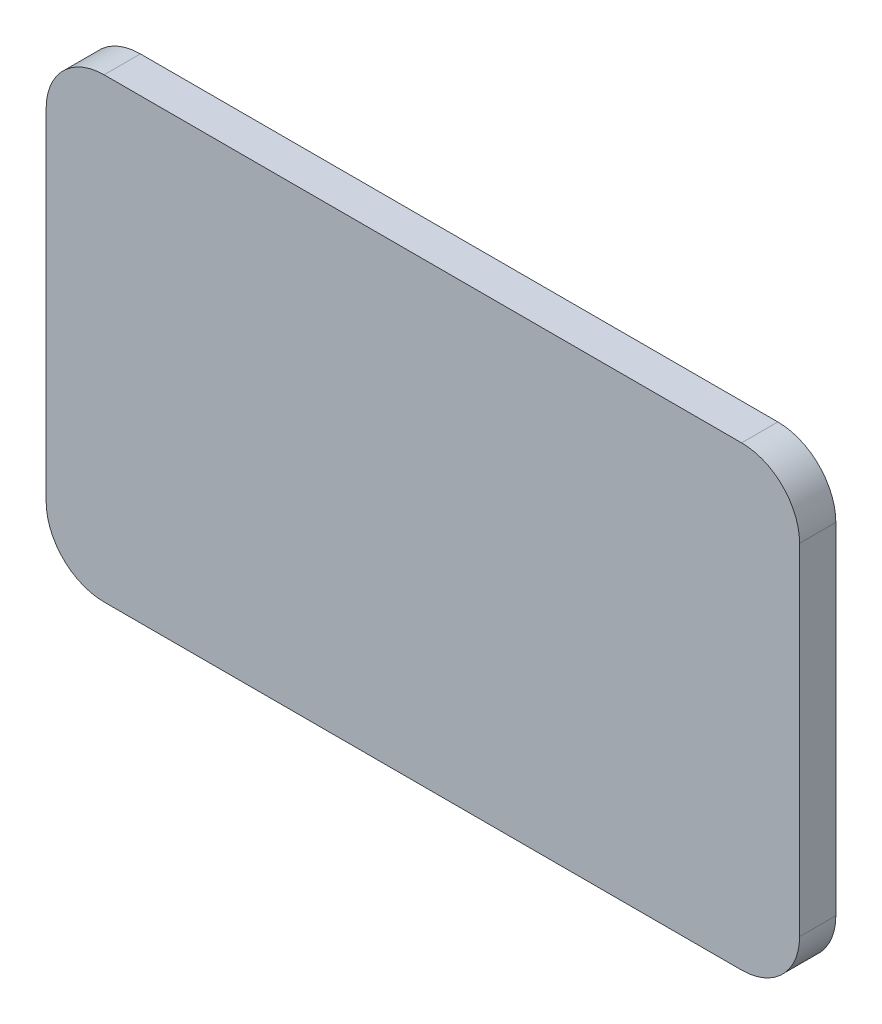
ISO-10303-21;
HEADER;
FILE_DESCRIPTION(('STEP AP214'),'2;1');
FILE_NAME('part.step','',(''),(''),'','','');
FILE_SCHEMA(('AUTOMOTIVE_DESIGN { 1 0 10303 214 1 1 1 1 }'));
ENDSEC;
DATA;
#1=APPLICATION_CONTEXT('core data for automotive mechanical design processes');
#2=APPLICATION_PROTOCOL_DEFINITION('international standard','automotive_design',2000,#1);
#3=PRODUCT_CONTEXT('',#1,'mechanical');
#4=PRODUCT('Part','Part','',(#3));
#5=PRODUCT_RELATED_PRODUCT_CATEGORY('part','',(#4));
#6=PRODUCT_DEFINITION_FORMATION('','',#4);
#7=PRODUCT_DEFINITION_CONTEXT('part definition',#1,'design');
#8=PRODUCT_DEFINITION('design','',#6,#7);
#9=PRODUCT_DEFINITION_SHAPE('','',#8);
#10=(LENGTH_UNIT() NAMED_UNIT(*) SI_UNIT(.MILLI.,.METRE.));
#11=(NAMED_UNIT(*) PLANE_ANGLE_UNIT() SI_UNIT($,.RADIAN.));
#12=(NAMED_UNIT(*) SI_UNIT($,.STERADIAN.) SOLID_ANGLE_UNIT());
#13=UNCERTAINTY_MEASURE_WITH_UNIT(LENGTH_MEASURE(1.E-05),#10,'distance_accuracy_value','');
#14=(GEOMETRIC_REPRESENTATION_CONTEXT(3) GLOBAL_UNCERTAINTY_ASSIGNED_CONTEXT((#13)) GLOBAL_UNIT_ASSIGNED_CONTEXT((#10,
#11,#12)) REPRESENTATION_CONTEXT('',''));
#15=CARTESIAN_POINT('',(0.,0.,0.));
#16=DIRECTION('',(0.,0.,1.));
#17=DIRECTION('',(1.,0.,0.));
#18=AXIS2_PLACEMENT_3D('',#15,#16,#17);
#19=CARTESIAN_POINT('',(-13.96,-7.46,1.5875));
#20=DIRECTION('',(0.,0.,-1.));
#21=DIRECTION('',(-1.,0.,0.));
#22=AXIS2_PLACEMENT_3D('',#19,#20,#21);
#23=CYLINDRICAL_SURFACE('',#22,2.54);
#24=CARTESIAN_POINT('',(-13.96,-7.46,0.));
#25=DIRECTION('',(0.,0.,1.));
#26=DIRECTION('',(-1.,0.,0.));
#27=AXIS2_PLACEMENT_3D('',#24,#25,#26);
#28=CIRCLE('',#27,2.54);
#29=CARTESIAN_POINT('',(-16.5,-7.46,0.));
#30=VERTEX_POINT('',#29);
#31=CARTESIAN_POINT('',(-13.96,-10.,0.));
#32=VERTEX_POINT('',#31);
#33=EDGE_CURVE('E131',#30,#32,#28,.T.);
#34=ORIENTED_EDGE('',*,*,#33,.T.);
#35=DIRECTION('',(0.,0.,-1.));
#36=VECTOR('',#35,1.);
#37=CARTESIAN_POINT('',(-13.96,-10.,1.5875));
#38=LINE('',#37,#36);
#39=CARTESIAN_POINT('',(-13.96,-10.,1.5875));
#40=VERTEX_POINT('',#39);
#41=EDGE_CURVE('E11',#40,#32,#38,.T.);
#42=ORIENTED_EDGE('',*,*,#41,.F.);
#43=CARTESIAN_POINT('',(-13.96,-7.46,1.5875));
#44=DIRECTION('',(0.,0.,1.));
#45=DIRECTION('',(-1.,0.,0.));
#46=AXIS2_PLACEMENT_3D('',#43,#44,#45);
#47=CIRCLE('',#46,2.54);
#48=CARTESIAN_POINT('',(-16.5,-7.46,1.5875));
#49=VERTEX_POINT('',#48);
#50=EDGE_CURVE('E145',#49,#40,#47,.T.);
#51=ORIENTED_EDGE('',*,*,#50,.F.);
#52=DIRECTION('',(0.,0.,-1.));
#53=VECTOR('',#52,1.);
#54=CARTESIAN_POINT('',(-16.5,-7.46,1.5875));
#55=LINE('',#54,#53);
#56=EDGE_CURVE('E127',#49,#30,#55,.T.);
#57=ORIENTED_EDGE('',*,*,#56,.T.);
#58=EDGE_LOOP('',(#34,#42,#51,#57));
#59=FACE_BOUND('',#58,.T.);
#60=ADVANCED_FACE('F35',(#59),#23,.T.);
#61=CARTESIAN_POINT('',(13.96,-10.,1.5875));
#62=DIRECTION('',(0.,1.,0.));
#63=DIRECTION('',(-1.,0.,0.));
#64=AXIS2_PLACEMENT_3D('',#61,#62,#63);
#65=PLANE('',#64);
#66=DIRECTION('',(1.,0.,0.));
#67=VECTOR('',#66,1.);
#68=CARTESIAN_POINT('',(13.96,-10.,0.));
#69=LINE('',#68,#67);
#70=CARTESIAN_POINT('',(13.96,-10.,0.));
#71=VERTEX_POINT('',#70);
#72=EDGE_CURVE('E134',#32,#71,#69,.T.);
#73=ORIENTED_EDGE('',*,*,#72,.T.);
#74=DIRECTION('',(0.,0.,-1.));
#75=VECTOR('',#74,1.);
#76=CARTESIAN_POINT('',(13.96,-10.,1.5875));
#77=LINE('',#76,#75);
#78=CARTESIAN_POINT('',(13.96,-10.,1.5875));
#79=VERTEX_POINT('',#78);
#80=EDGE_CURVE('E43',#79,#71,#77,.T.);
#81=ORIENTED_EDGE('',*,*,#80,.F.);
#82=DIRECTION('',(1.,0.,0.));
#83=VECTOR('',#82,1.);
#84=CARTESIAN_POINT('',(13.96,-10.,1.5875));
#85=LINE('',#84,#83);
#86=EDGE_CURVE('E94',#40,#79,#85,.T.);
#87=ORIENTED_EDGE('',*,*,#86,.F.);
#88=ORIENTED_EDGE('',*,*,#41,.T.);
#89=EDGE_LOOP('',(#73,#81,#87,#88));
#90=FACE_BOUND('',#89,.T.);
#91=ADVANCED_FACE('F180',(#90),#65,.F.);
#92=CARTESIAN_POINT('',(13.96,-7.46,1.5875));
#93=DIRECTION('',(0.,0.,-1.));
#94=DIRECTION('',(-1.,0.,0.));
#95=AXIS2_PLACEMENT_3D('',#92,#93,#94);
#96=CYLINDRICAL_SURFACE('',#95,2.54);
#97=CARTESIAN_POINT('',(13.96,-7.46,0.));
#98=DIRECTION('',(0.,0.,1.));
#99=DIRECTION('',(1.,0.,0.));
#100=AXIS2_PLACEMENT_3D('',#97,#98,#99);
#101=CIRCLE('',#100,2.54);
#102=CARTESIAN_POINT('',(16.5,-7.46,0.));
#103=VERTEX_POINT('',#102);
#104=EDGE_CURVE('E136',#71,#103,#101,.T.);
#105=ORIENTED_EDGE('',*,*,#104,.T.);
#106=DIRECTION('',(0.,0.,-1.));
#107=VECTOR('',#106,1.);
#108=CARTESIAN_POINT('',(16.5,-7.46,1.5875));
#109=LINE('',#108,#107);
#110=CARTESIAN_POINT('',(16.5,-7.46,1.5875));
#111=VERTEX_POINT('',#110);
#112=EDGE_CURVE('E152',#111,#103,#109,.T.);
#113=ORIENTED_EDGE('',*,*,#112,.F.);
#114=CARTESIAN_POINT('',(13.96,-7.46,1.5875));
#115=DIRECTION('',(0.,0.,1.));
#116=DIRECTION('',(1.,0.,0.));
#117=AXIS2_PLACEMENT_3D('',#114,#115,#116);
#118=CIRCLE('',#117,2.54);
#119=EDGE_CURVE('E160',#79,#111,#118,.T.);
#120=ORIENTED_EDGE('',*,*,#119,.F.);
#121=ORIENTED_EDGE('',*,*,#80,.T.);
#122=EDGE_LOOP('',(#105,#113,#120,#121));
#123=FACE_BOUND('',#122,.T.);
#124=ADVANCED_FACE('F158',(#123),#96,.T.);
#125=CARTESIAN_POINT('',(16.5,-7.46,1.5875));
#126=DIRECTION('',(-1.,0.,0.));
#127=DIRECTION('',(0.,-1.,0.));
#128=AXIS2_PLACEMENT_3D('',#125,#126,#127);
#129=PLANE('',#128);
#130=DIRECTION('',(0.,1.,0.));
#131=VECTOR('',#130,1.);
#132=CARTESIAN_POINT('',(16.5,-7.46,0.));
#133=LINE('',#132,#131);
#134=CARTESIAN_POINT('',(16.5,7.46,0.));
#135=VERTEX_POINT('',#134);
#136=EDGE_CURVE('E138',#103,#135,#133,.T.);
#137=ORIENTED_EDGE('',*,*,#136,.T.);
#138=DIRECTION('',(0.,0.,-1.));
#139=VECTOR('',#138,1.);
#140=CARTESIAN_POINT('',(16.5,7.46,1.5875));
#141=LINE('',#140,#139);
#142=CARTESIAN_POINT('',(16.5,7.46,1.5875));
#143=VERTEX_POINT('',#142);
#144=EDGE_CURVE('E149',#143,#135,#141,.T.);
#145=ORIENTED_EDGE('',*,*,#144,.F.);
#146=DIRECTION('',(0.,1.,0.));
#147=VECTOR('',#146,1.);
#148=CARTESIAN_POINT('',(16.5,-7.46,1.5875));
#149=LINE('',#148,#147);
#150=EDGE_CURVE('E172',#111,#143,#149,.T.);
#151=ORIENTED_EDGE('',*,*,#150,.F.);
#152=ORIENTED_EDGE('',*,*,#112,.T.);
#153=EDGE_LOOP('',(#137,#145,#151,#152));
#154=FACE_BOUND('',#153,.T.);
#155=ADVANCED_FACE('F168',(#154),#129,.F.);
#156=CARTESIAN_POINT('',(13.96,7.46,1.5875));
#157=DIRECTION('',(0.,0.,-1.));
#158=DIRECTION('',(-1.,0.,0.));
#159=AXIS2_PLACEMENT_3D('',#156,#157,#158);
#160=CYLINDRICAL_SURFACE('',#159,2.54);
#161=CARTESIAN_POINT('',(13.96,7.46,0.));
#162=DIRECTION('',(0.,0.,1.));
#163=DIRECTION('',(1.,0.,0.));
#164=AXIS2_PLACEMENT_3D('',#161,#162,#163);
#165=CIRCLE('',#164,2.54);
#166=CARTESIAN_POINT('',(13.96,10.,0.));
#167=VERTEX_POINT('',#166);
#168=EDGE_CURVE('E140',#135,#167,#165,.T.);
#169=ORIENTED_EDGE('',*,*,#168,.T.);
#170=DIRECTION('',(0.,0.,-1.));
#171=VECTOR('',#170,1.);
#172=CARTESIAN_POINT('',(13.96,10.,1.5875));
#173=LINE('',#172,#171);
#174=CARTESIAN_POINT('',(13.96,10.,1.5875));
#175=VERTEX_POINT('',#174);
#176=EDGE_CURVE('E122',#175,#167,#173,.T.);
#177=ORIENTED_EDGE('',*,*,#176,.F.);
#178=CARTESIAN_POINT('',(13.96,7.46,1.5875));
#179=DIRECTION('',(0.,0.,1.));
#180=DIRECTION('',(1.,0.,0.));
#181=AXIS2_PLACEMENT_3D('',#178,#179,#180);
#182=CIRCLE('',#181,2.54);
#183=EDGE_CURVE('E113',#143,#175,#182,.T.);
#184=ORIENTED_EDGE('',*,*,#183,.F.);
#185=ORIENTED_EDGE('',*,*,#144,.T.);
#186=EDGE_LOOP('',(#169,#177,#184,#185));
#187=FACE_BOUND('',#186,.T.);
#188=ADVANCED_FACE('F171',(#187),#160,.T.);
#189=CARTESIAN_POINT('',(13.96,10.,1.5875));
#190=DIRECTION('',(0.,-1.,0.));
#191=DIRECTION('',(1.,0.,0.));
#192=AXIS2_PLACEMENT_3D('',#189,#190,#191);
#193=PLANE('',#192);
#194=DIRECTION('',(-1.,0.,0.));
#195=VECTOR('',#194,1.);
#196=CARTESIAN_POINT('',(13.96,10.,0.));
#197=LINE('',#196,#195);
#198=CARTESIAN_POINT('',(-13.96,10.,0.));
#199=VERTEX_POINT('',#198);
#200=EDGE_CURVE('E121',#167,#199,#197,.T.);
#201=ORIENTED_EDGE('',*,*,#200,.T.);
#202=DIRECTION('',(0.,0.,-1.));
#203=VECTOR('',#202,1.);
#204=CARTESIAN_POINT('',(-13.96,10.,1.5875));
#205=LINE('',#204,#203);
#206=CARTESIAN_POINT('',(-13.96,10.,1.5875));
#207=VERTEX_POINT('',#206);
#208=EDGE_CURVE('E118',#207,#199,#205,.T.);
#209=ORIENTED_EDGE('',*,*,#208,.F.);
#210=DIRECTION('',(-1.,0.,0.));
#211=VECTOR('',#210,1.);
#212=CARTESIAN_POINT('',(13.96,10.,1.5875));
#213=LINE('',#212,#211);
#214=EDGE_CURVE('E107',#175,#207,#213,.T.);
#215=ORIENTED_EDGE('',*,*,#214,.F.);
#216=ORIENTED_EDGE('',*,*,#176,.T.);
#217=EDGE_LOOP('',(#201,#209,#215,#216));
#218=FACE_BOUND('',#217,.T.);
#219=ADVANCED_FACE('F119',(#218),#193,.F.);
#220=CARTESIAN_POINT('',(-13.96,7.46,1.5875));
#221=DIRECTION('',(0.,0.,-1.));
#222=DIRECTION('',(-1.,0.,0.));
#223=AXIS2_PLACEMENT_3D('',#220,#221,#222);
#224=CYLINDRICAL_SURFACE('',#223,2.54);
#225=CARTESIAN_POINT('',(-13.96,7.46,0.));
#226=DIRECTION('',(0.,0.,1.));
#227=DIRECTION('',(1.,0.,0.));
#228=AXIS2_PLACEMENT_3D('',#225,#226,#227);
#229=CIRCLE('',#228,2.54);
#230=CARTESIAN_POINT('',(-16.5,7.46,0.));
#231=VERTEX_POINT('',#230);
#232=EDGE_CURVE('E80',#199,#231,#229,.T.);
#233=ORIENTED_EDGE('',*,*,#232,.T.);
#234=DIRECTION('',(0.,0.,-1.));
#235=VECTOR('',#234,1.);
#236=CARTESIAN_POINT('',(-16.5,7.46,1.5875));
#237=LINE('',#236,#235);
#238=CARTESIAN_POINT('',(-16.5,7.46,1.5875));
#239=VERTEX_POINT('',#238);
#240=EDGE_CURVE('E123',#239,#231,#237,.T.);
#241=ORIENTED_EDGE('',*,*,#240,.F.);
#242=CARTESIAN_POINT('',(-13.96,7.46,1.5875));
#243=DIRECTION('',(0.,0.,1.));
#244=DIRECTION('',(1.,0.,0.));
#245=AXIS2_PLACEMENT_3D('',#242,#243,#244);
#246=CIRCLE('',#245,2.54);
#247=EDGE_CURVE('E111',#207,#239,#246,.T.);
#248=ORIENTED_EDGE('',*,*,#247,.F.);
#249=ORIENTED_EDGE('',*,*,#208,.T.);
#250=EDGE_LOOP('',(#233,#241,#248,#249));
#251=FACE_BOUND('',#250,.T.);
#252=ADVANCED_FACE('F125',(#251),#224,.T.);
#253=CARTESIAN_POINT('',(-16.5,-7.46,1.5875));
#254=DIRECTION('',(1.,0.,0.));
#255=DIRECTION('',(0.,1.,0.));
#256=AXIS2_PLACEMENT_3D('',#253,#254,#255);
#257=PLANE('',#256);
#258=DIRECTION('',(0.,-1.,0.));
#259=VECTOR('',#258,1.);
#260=CARTESIAN_POINT('',(-16.5,-7.46,0.));
#261=LINE('',#260,#259);
#262=EDGE_CURVE('E86',#231,#30,#261,.T.);
#263=ORIENTED_EDGE('',*,*,#262,.T.);
#264=ORIENTED_EDGE('',*,*,#56,.F.);
#265=DIRECTION('',(0.,-1.,0.));
#266=VECTOR('',#265,1.);
#267=CARTESIAN_POINT('',(-16.5,-7.46,1.5875));
#268=LINE('',#267,#266);
#269=EDGE_CURVE('E51',#239,#49,#268,.T.);
#270=ORIENTED_EDGE('',*,*,#269,.F.);
#271=ORIENTED_EDGE('',*,*,#240,.T.);
#272=EDGE_LOOP('',(#263,#264,#270,#271));
#273=FACE_BOUND('',#272,.T.);
#274=ADVANCED_FACE('F196',(#273),#257,.F.);
#275=CARTESIAN_POINT('',(-13.96,-7.46,1.5875));
#276=DIRECTION('',(0.,0.,-1.));
#277=DIRECTION('',(-1.,0.,0.));
#278=AXIS2_PLACEMENT_3D('',#275,#276,#277);
#279=PLANE('',#278);
#280=ORIENTED_EDGE('',*,*,#50,.T.);
#281=ORIENTED_EDGE('',*,*,#86,.T.);
#282=ORIENTED_EDGE('',*,*,#119,.T.);
#283=ORIENTED_EDGE('',*,*,#150,.T.);
#284=ORIENTED_EDGE('',*,*,#183,.T.);
#285=ORIENTED_EDGE('',*,*,#214,.T.);
#286=ORIENTED_EDGE('',*,*,#247,.T.);
#287=ORIENTED_EDGE('',*,*,#269,.T.);
#288=EDGE_LOOP('',(#280,#281,#282,#283,#284,#285,#286,#287));
#289=FACE_BOUND('',#288,.T.);
#290=ADVANCED_FACE('F109',(#289),#279,.F.);
#291=CARTESIAN_POINT('',(-13.96,-7.46,0.));
#292=DIRECTION('',(0.,0.,-1.));
#293=DIRECTION('',(-1.,0.,0.));
#294=AXIS2_PLACEMENT_3D('',#291,#292,#293);
#295=PLANE('',#294);
#296=ORIENTED_EDGE('',*,*,#33,.F.);
#297=ORIENTED_EDGE('',*,*,#262,.F.);
#298=ORIENTED_EDGE('',*,*,#232,.F.);
#299=ORIENTED_EDGE('',*,*,#200,.F.);
#300=ORIENTED_EDGE('',*,*,#168,.F.);
#301=ORIENTED_EDGE('',*,*,#136,.F.);
#302=ORIENTED_EDGE('',*,*,#104,.F.);
#303=ORIENTED_EDGE('',*,*,#72,.F.);
#304=EDGE_LOOP('',(#296,#297,#298,#299,#300,#301,#302,#303));
#305=FACE_BOUND('',#304,.T.);
#306=ADVANCED_FACE('F164',(#305),#295,.T.);
#307=CLOSED_SHELL('',(#60,#91,#124,#155,#188,#219,#252,#274,#290,#306));
#308=MANIFOLD_SOLID_BREP('B2',#307);
#309=ADVANCED_BREP_SHAPE_REPRESENTATION('',(#18,#308),#14);
#310=SHAPE_DEFINITION_REPRESENTATION(#9,#309);
ENDSEC;
END-ISO-10303-21;
